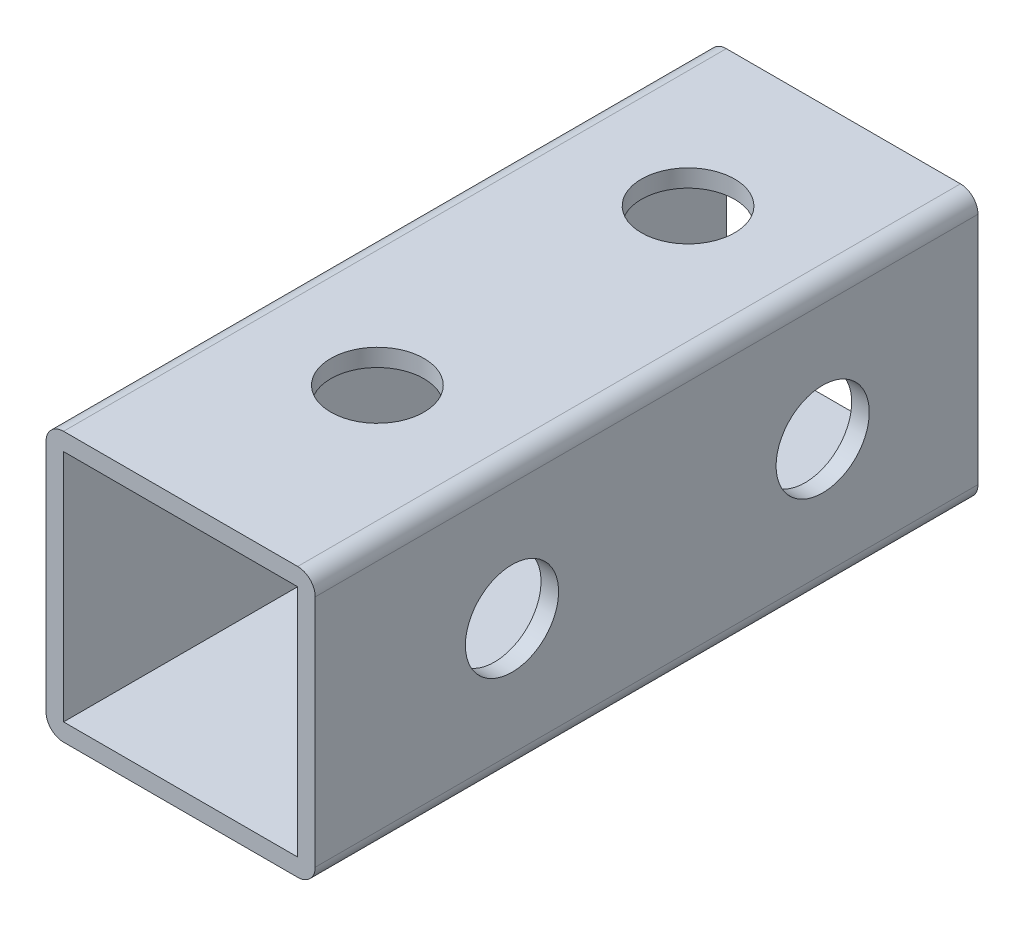
ISO-10303-21;
HEADER;
FILE_DESCRIPTION(('STEP AP214'),'2;1');
FILE_NAME('part.step','',(''),(''),'','','');
FILE_SCHEMA(('AUTOMOTIVE_DESIGN { 1 0 10303 214 1 1 1 1 }'));
ENDSEC;
DATA;
#1=APPLICATION_CONTEXT('core data for automotive mechanical design processes');
#2=APPLICATION_PROTOCOL_DEFINITION('international standard','automotive_design',2000,#1);
#3=PRODUCT_CONTEXT('',#1,'mechanical');
#4=PRODUCT('Part','Part','',(#3));
#5=PRODUCT_RELATED_PRODUCT_CATEGORY('part','',(#4));
#6=PRODUCT_DEFINITION_FORMATION('','',#4);
#7=PRODUCT_DEFINITION_CONTEXT('part definition',#1,'design');
#8=PRODUCT_DEFINITION('design','',#6,#7);
#9=PRODUCT_DEFINITION_SHAPE('','',#8);
#10=(LENGTH_UNIT() NAMED_UNIT(*) SI_UNIT(.MILLI.,.METRE.));
#11=(NAMED_UNIT(*) PLANE_ANGLE_UNIT() SI_UNIT($,.RADIAN.));
#12=(NAMED_UNIT(*) SI_UNIT($,.STERADIAN.) SOLID_ANGLE_UNIT());
#13=UNCERTAINTY_MEASURE_WITH_UNIT(LENGTH_MEASURE(1.E-05),#10,'distance_accuracy_value','');
#14=(GEOMETRIC_REPRESENTATION_CONTEXT(3) GLOBAL_UNCERTAINTY_ASSIGNED_CONTEXT((#13)) GLOBAL_UNIT_ASSIGNED_CONTEXT((#10,
#11,#12)) REPRESENTATION_CONTEXT('',''));
#15=CARTESIAN_POINT('',(0.,0.,0.));
#16=DIRECTION('',(0.,0.,1.));
#17=DIRECTION('',(1.,0.,0.));
#18=AXIS2_PLACEMENT_3D('',#15,#16,#17);
#19=CARTESIAN_POINT('',(17.9451,17.9451,101.6));
#20=DIRECTION('',(0.,0.,-1.));
#21=DIRECTION('',(-1.,0.,0.));
#22=AXIS2_PLACEMENT_3D('',#19,#20,#21);
#23=PLANE('',#22);
#24=CARTESIAN_POINT('',(17.9451,17.9451,101.6));
#25=DIRECTION('',(0.,0.,1.));
#26=DIRECTION('',(-1.,0.,0.));
#27=AXIS2_PLACEMENT_3D('',#24,#25,#26);
#28=CIRCLE('',#27,2.6924);
#29=CARTESIAN_POINT('',(20.6375,17.9451,101.6));
#30=VERTEX_POINT('',#29);
#31=CARTESIAN_POINT('',(17.9451,20.6375,101.6));
#32=VERTEX_POINT('',#31);
#33=EDGE_CURVE('E161',#30,#32,#28,.T.);
#34=ORIENTED_EDGE('',*,*,#33,.T.);
#35=DIRECTION('',(-1.,0.,0.));
#36=VECTOR('',#35,1.);
#37=CARTESIAN_POINT('',(-17.9451,20.6375,101.6));
#38=LINE('',#37,#36);
#39=CARTESIAN_POINT('',(-17.9451,20.6375,101.6));
#40=VERTEX_POINT('',#39);
#41=EDGE_CURVE('E164',#32,#40,#38,.T.);
#42=ORIENTED_EDGE('',*,*,#41,.T.);
#43=CARTESIAN_POINT('',(-17.9451,17.9451,101.6));
#44=DIRECTION('',(0.,0.,1.));
#45=DIRECTION('',(1.,0.,0.));
#46=AXIS2_PLACEMENT_3D('',#43,#44,#45);
#47=CIRCLE('',#46,2.6924);
#48=CARTESIAN_POINT('',(-20.6375,17.9451,101.6));
#49=VERTEX_POINT('',#48);
#50=EDGE_CURVE('E167',#40,#49,#47,.T.);
#51=ORIENTED_EDGE('',*,*,#50,.T.);
#52=DIRECTION('',(0.,-1.,0.));
#53=VECTOR('',#52,1.);
#54=CARTESIAN_POINT('',(-20.6375,17.9451,101.6));
#55=LINE('',#54,#53);
#56=CARTESIAN_POINT('',(-20.6375,-17.9451,101.6));
#57=VERTEX_POINT('',#56);
#58=EDGE_CURVE('E169',#49,#57,#55,.T.);
#59=ORIENTED_EDGE('',*,*,#58,.T.);
#60=CARTESIAN_POINT('',(-17.9451,-17.9451,101.6));
#61=DIRECTION('',(0.,0.,1.));
#62=DIRECTION('',(-1.,0.,0.));
#63=AXIS2_PLACEMENT_3D('',#60,#61,#62);
#64=CIRCLE('',#63,2.6924);
#65=CARTESIAN_POINT('',(-17.9451,-20.6375,101.6));
#66=VERTEX_POINT('',#65);
#67=EDGE_CURVE('E171',#57,#66,#64,.T.);
#68=ORIENTED_EDGE('',*,*,#67,.T.);
#69=DIRECTION('',(1.,0.,0.));
#70=VECTOR('',#69,1.);
#71=CARTESIAN_POINT('',(-17.9451,-20.6375,101.6));
#72=LINE('',#71,#70);
#73=CARTESIAN_POINT('',(17.9451,-20.6375,101.6));
#74=VERTEX_POINT('',#73);
#75=EDGE_CURVE('E173',#66,#74,#72,.T.);
#76=ORIENTED_EDGE('',*,*,#75,.T.);
#77=CARTESIAN_POINT('',(17.9451,-17.9451,101.6));
#78=DIRECTION('',(0.,0.,1.));
#79=DIRECTION('',(1.,0.,0.));
#80=AXIS2_PLACEMENT_3D('',#77,#78,#79);
#81=CIRCLE('',#80,2.6924);
#82=CARTESIAN_POINT('',(20.6375,-17.9451,101.6));
#83=VERTEX_POINT('',#82);
#84=EDGE_CURVE('E175',#74,#83,#81,.T.);
#85=ORIENTED_EDGE('',*,*,#84,.T.);
#86=DIRECTION('',(0.,1.,0.));
#87=VECTOR('',#86,1.);
#88=CARTESIAN_POINT('',(20.6375,-17.9451,101.6));
#89=LINE('',#88,#87);
#90=EDGE_CURVE('E177',#83,#30,#89,.T.);
#91=ORIENTED_EDGE('',*,*,#90,.T.);
#92=EDGE_LOOP('',(#34,#42,#51,#59,#68,#76,#85,#91));
#93=FACE_BOUND('',#92,.T.);
#94=DIRECTION('',(0.,1.,0.));
#95=VECTOR('',#94,1.);
#96=CARTESIAN_POINT('',(17.9451,-17.9451,101.6));
#97=LINE('',#96,#95);
#98=CARTESIAN_POINT('',(17.9451,-17.9451,101.6));
#99=VERTEX_POINT('',#98);
#100=CARTESIAN_POINT('',(17.9451,17.9451,101.6));
#101=VERTEX_POINT('',#100);
#102=EDGE_CURVE('E123',#99,#101,#97,.T.);
#103=ORIENTED_EDGE('',*,*,#102,.F.);
#104=DIRECTION('',(1.,0.,0.));
#105=VECTOR('',#104,1.);
#106=CARTESIAN_POINT('',(-17.9451,-17.9451,101.6));
#107=LINE('',#106,#105);
#108=CARTESIAN_POINT('',(-17.9451,-17.9451,101.6));
#109=VERTEX_POINT('',#108);
#110=EDGE_CURVE('E145',#109,#99,#107,.T.);
#111=ORIENTED_EDGE('',*,*,#110,.F.);
#112=DIRECTION('',(0.,-1.,0.));
#113=VECTOR('',#112,1.);
#114=CARTESIAN_POINT('',(-17.9451,17.9451,101.6));
#115=LINE('',#114,#113);
#116=CARTESIAN_POINT('',(-17.9451,17.9451,101.6));
#117=VERTEX_POINT('',#116);
#118=EDGE_CURVE('E143',#117,#109,#115,.T.);
#119=ORIENTED_EDGE('',*,*,#118,.F.);
#120=DIRECTION('',(-1.,0.,0.));
#121=VECTOR('',#120,1.);
#122=CARTESIAN_POINT('',(-17.9451,17.9451,101.6));
#123=LINE('',#122,#121);
#124=EDGE_CURVE('E131',#101,#117,#123,.T.);
#125=ORIENTED_EDGE('',*,*,#124,.F.);
#126=EDGE_LOOP('',(#103,#111,#119,#125));
#127=FACE_BOUND('',#126,.T.);
#128=ADVANCED_FACE('F32',(#93,#127),#23,.F.);
#129=CARTESIAN_POINT('',(17.9451,17.9451,0.));
#130=DIRECTION('',(0.,0.,-1.));
#131=DIRECTION('',(-1.,0.,0.));
#132=AXIS2_PLACEMENT_3D('',#129,#130,#131);
#133=PLANE('',#132);
#134=CARTESIAN_POINT('',(17.9451,17.9451,0.));
#135=DIRECTION('',(0.,0.,1.));
#136=DIRECTION('',(-1.,0.,0.));
#137=AXIS2_PLACEMENT_3D('',#134,#135,#136);
#138=CIRCLE('',#137,2.6924);
#139=CARTESIAN_POINT('',(20.6375,17.9451,0.));
#140=VERTEX_POINT('',#139);
#141=CARTESIAN_POINT('',(17.9451,20.6375,0.));
#142=VERTEX_POINT('',#141);
#143=EDGE_CURVE('E139',#140,#142,#138,.T.);
#144=ORIENTED_EDGE('',*,*,#143,.F.);
#145=DIRECTION('',(0.,1.,0.));
#146=VECTOR('',#145,1.);
#147=CARTESIAN_POINT('',(20.6375,-17.9451,0.));
#148=LINE('',#147,#146);
#149=CARTESIAN_POINT('',(20.6375,-17.9451,0.));
#150=VERTEX_POINT('',#149);
#151=EDGE_CURVE('E165',#150,#140,#148,.T.);
#152=ORIENTED_EDGE('',*,*,#151,.F.);
#153=CARTESIAN_POINT('',(17.9451,-17.9451,0.));
#154=DIRECTION('',(0.,0.,1.));
#155=DIRECTION('',(1.,0.,0.));
#156=AXIS2_PLACEMENT_3D('',#153,#154,#155);
#157=CIRCLE('',#156,2.6924);
#158=CARTESIAN_POINT('',(17.9451,-20.6375,0.));
#159=VERTEX_POINT('',#158);
#160=EDGE_CURVE('E192',#159,#150,#157,.T.);
#161=ORIENTED_EDGE('',*,*,#160,.F.);
#162=DIRECTION('',(1.,0.,0.));
#163=VECTOR('',#162,1.);
#164=CARTESIAN_POINT('',(-17.9451,-20.6375,0.));
#165=LINE('',#164,#163);
#166=CARTESIAN_POINT('',(-17.9451,-20.6375,0.));
#167=VERTEX_POINT('',#166);
#168=EDGE_CURVE('E190',#167,#159,#165,.T.);
#169=ORIENTED_EDGE('',*,*,#168,.F.);
#170=CARTESIAN_POINT('',(-17.9451,-17.9451,0.));
#171=DIRECTION('',(0.,0.,1.));
#172=DIRECTION('',(-1.,0.,0.));
#173=AXIS2_PLACEMENT_3D('',#170,#171,#172);
#174=CIRCLE('',#173,2.6924);
#175=CARTESIAN_POINT('',(-20.6375,-17.9451,0.));
#176=VERTEX_POINT('',#175);
#177=EDGE_CURVE('E188',#176,#167,#174,.T.);
#178=ORIENTED_EDGE('',*,*,#177,.F.);
#179=DIRECTION('',(0.,-1.,0.));
#180=VECTOR('',#179,1.);
#181=CARTESIAN_POINT('',(-20.6375,17.9451,0.));
#182=LINE('',#181,#180);
#183=CARTESIAN_POINT('',(-20.6375,17.9451,0.));
#184=VERTEX_POINT('',#183);
#185=EDGE_CURVE('E186',#184,#176,#182,.T.);
#186=ORIENTED_EDGE('',*,*,#185,.F.);
#187=CARTESIAN_POINT('',(-17.9451,17.9451,0.));
#188=DIRECTION('',(0.,0.,1.));
#189=DIRECTION('',(1.,0.,0.));
#190=AXIS2_PLACEMENT_3D('',#187,#188,#189);
#191=CIRCLE('',#190,2.6924);
#192=CARTESIAN_POINT('',(-17.9451,20.6375,0.));
#193=VERTEX_POINT('',#192);
#194=EDGE_CURVE('E184',#193,#184,#191,.T.);
#195=ORIENTED_EDGE('',*,*,#194,.F.);
#196=DIRECTION('',(-1.,0.,0.));
#197=VECTOR('',#196,1.);
#198=CARTESIAN_POINT('',(-17.9451,20.6375,0.));
#199=LINE('',#198,#197);
#200=EDGE_CURVE('E182',#142,#193,#199,.T.);
#201=ORIENTED_EDGE('',*,*,#200,.F.);
#202=EDGE_LOOP('',(#144,#152,#161,#169,#178,#186,#195,#201));
#203=FACE_BOUND('',#202,.T.);
#204=DIRECTION('',(1.,0.,0.));
#205=VECTOR('',#204,1.);
#206=CARTESIAN_POINT('',(-17.9451,-17.9451,0.));
#207=LINE('',#206,#205);
#208=CARTESIAN_POINT('',(-17.9451,-17.9451,0.));
#209=VERTEX_POINT('',#208);
#210=CARTESIAN_POINT('',(17.9451,-17.9451,0.));
#211=VERTEX_POINT('',#210);
#212=EDGE_CURVE('E132',#209,#211,#207,.T.);
#213=ORIENTED_EDGE('',*,*,#212,.T.);
#214=DIRECTION('',(0.,1.,0.));
#215=VECTOR('',#214,1.);
#216=CARTESIAN_POINT('',(17.9451,-17.9451,0.));
#217=LINE('',#216,#215);
#218=CARTESIAN_POINT('',(17.9451,17.9451,0.));
#219=VERTEX_POINT('',#218);
#220=EDGE_CURVE('E57',#211,#219,#217,.T.);
#221=ORIENTED_EDGE('',*,*,#220,.T.);
#222=DIRECTION('',(-1.,0.,0.));
#223=VECTOR('',#222,1.);
#224=CARTESIAN_POINT('',(-17.9451,17.9451,0.));
#225=LINE('',#224,#223);
#226=CARTESIAN_POINT('',(-17.9451,17.9451,0.));
#227=VERTEX_POINT('',#226);
#228=EDGE_CURVE('E138',#219,#227,#225,.T.);
#229=ORIENTED_EDGE('',*,*,#228,.T.);
#230=DIRECTION('',(0.,-1.,0.));
#231=VECTOR('',#230,1.);
#232=CARTESIAN_POINT('',(-17.9451,17.9451,0.));
#233=LINE('',#232,#231);
#234=EDGE_CURVE('E153',#227,#209,#233,.T.);
#235=ORIENTED_EDGE('',*,*,#234,.T.);
#236=EDGE_LOOP('',(#213,#221,#229,#235));
#237=FACE_BOUND('',#236,.T.);
#238=ADVANCED_FACE('F281',(#203,#237),#133,.T.);
#239=CARTESIAN_POINT('',(17.9451,17.9451,101.6));
#240=DIRECTION('',(0.,0.,-1.));
#241=DIRECTION('',(-1.,0.,0.));
#242=AXIS2_PLACEMENT_3D('',#239,#240,#241);
#243=CYLINDRICAL_SURFACE('',#242,2.6924);
#244=ORIENTED_EDGE('',*,*,#143,.T.);
#245=DIRECTION('',(0.,0.,-1.));
#246=VECTOR('',#245,1.);
#247=CARTESIAN_POINT('',(17.9451,20.6375,101.6));
#248=LINE('',#247,#246);
#249=EDGE_CURVE('E11',#32,#142,#248,.T.);
#250=ORIENTED_EDGE('',*,*,#249,.F.);
#251=ORIENTED_EDGE('',*,*,#33,.F.);
#252=DIRECTION('',(0.,0.,-1.));
#253=VECTOR('',#252,1.);
#254=CARTESIAN_POINT('',(20.6375,17.9451,101.6));
#255=LINE('',#254,#253);
#256=EDGE_CURVE('E179',#30,#140,#255,.T.);
#257=ORIENTED_EDGE('',*,*,#256,.T.);
#258=EDGE_LOOP('',(#244,#250,#251,#257));
#259=FACE_BOUND('',#258,.T.);
#260=ADVANCED_FACE('F34',(#259),#243,.T.);
#261=CARTESIAN_POINT('',(-17.9451,20.6375,101.6));
#262=DIRECTION('',(0.,-1.,0.));
#263=DIRECTION('',(0.,0.,-1.));
#264=AXIS2_PLACEMENT_3D('',#261,#262,#263);
#265=PLANE('',#264);
#266=CARTESIAN_POINT('',(0.,20.6375,71.4375));
#267=DIRECTION('',(0.,1.,0.));
#268=DIRECTION('',(0.,0.,1.));
#269=AXIS2_PLACEMENT_3D('',#266,#267,#268);
#270=CIRCLE('',#269,7.14375);
#271=CARTESIAN_POINT('',(0.,20.6375,78.58125));
#272=VERTEX_POINT('',#271);
#273=EDGE_CURVE('E233',#272,#272,#270,.T.);
#274=ORIENTED_EDGE('',*,*,#273,.F.);
#275=EDGE_LOOP('',(#274));
#276=FACE_BOUND('',#275,.T.);
#277=CARTESIAN_POINT('',(0.,20.6375,23.8125));
#278=DIRECTION('',(0.,1.,0.));
#279=DIRECTION('',(0.,0.,1.));
#280=AXIS2_PLACEMENT_3D('',#277,#278,#279);
#281=CIRCLE('',#280,7.14375);
#282=CARTESIAN_POINT('',(0.,20.6375,30.95625));
#283=VERTEX_POINT('',#282);
#284=EDGE_CURVE('E255',#283,#283,#281,.T.);
#285=ORIENTED_EDGE('',*,*,#284,.F.);
#286=EDGE_LOOP('',(#285));
#287=FACE_BOUND('',#286,.T.);
#288=ORIENTED_EDGE('',*,*,#200,.T.);
#289=DIRECTION('',(0.,0.,-1.));
#290=VECTOR('',#289,1.);
#291=CARTESIAN_POINT('',(-17.9451,20.6375,101.6));
#292=LINE('',#291,#290);
#293=EDGE_CURVE('E41',#40,#193,#292,.T.);
#294=ORIENTED_EDGE('',*,*,#293,.F.);
#295=ORIENTED_EDGE('',*,*,#41,.F.);
#296=ORIENTED_EDGE('',*,*,#249,.T.);
#297=EDGE_LOOP('',(#288,#294,#295,#296));
#298=FACE_BOUND('',#297,.T.);
#299=ADVANCED_FACE('F310',(#276,#287,#298),#265,.F.);
#300=CARTESIAN_POINT('',(-17.9451,17.9451,101.6));
#301=DIRECTION('',(0.,0.,-1.));
#302=DIRECTION('',(-1.,0.,0.));
#303=AXIS2_PLACEMENT_3D('',#300,#301,#302);
#304=CYLINDRICAL_SURFACE('',#303,2.6924);
#305=ORIENTED_EDGE('',*,*,#194,.T.);
#306=DIRECTION('',(0.,0.,-1.));
#307=VECTOR('',#306,1.);
#308=CARTESIAN_POINT('',(-20.6375,17.9451,101.6));
#309=LINE('',#308,#307);
#310=EDGE_CURVE('E209',#49,#184,#309,.T.);
#311=ORIENTED_EDGE('',*,*,#310,.F.);
#312=ORIENTED_EDGE('',*,*,#50,.F.);
#313=ORIENTED_EDGE('',*,*,#293,.T.);
#314=EDGE_LOOP('',(#305,#311,#312,#313));
#315=FACE_BOUND('',#314,.T.);
#316=ADVANCED_FACE('F307',(#315),#304,.T.);
#317=CARTESIAN_POINT('',(-20.6375,17.9451,101.6));
#318=DIRECTION('',(1.,0.,0.));
#319=DIRECTION('',(0.,0.,-1.));
#320=AXIS2_PLACEMENT_3D('',#317,#318,#319);
#321=PLANE('',#320);
#322=CARTESIAN_POINT('',(-20.6375,0.,71.4375));
#323=DIRECTION('',(-1.,0.,0.));
#324=DIRECTION('',(0.,0.,1.));
#325=AXIS2_PLACEMENT_3D('',#322,#323,#324);
#326=CIRCLE('',#325,7.14375);
#327=CARTESIAN_POINT('',(-20.6375,0.,78.58125));
#328=VERTEX_POINT('',#327);
#329=EDGE_CURVE('E235',#328,#328,#326,.T.);
#330=ORIENTED_EDGE('',*,*,#329,.F.);
#331=EDGE_LOOP('',(#330));
#332=FACE_BOUND('',#331,.T.);
#333=CARTESIAN_POINT('',(-20.6375,0.,23.8125));
#334=DIRECTION('',(-1.,0.,0.));
#335=DIRECTION('',(0.,0.,1.));
#336=AXIS2_PLACEMENT_3D('',#333,#334,#335);
#337=CIRCLE('',#336,7.14375);
#338=CARTESIAN_POINT('',(-20.6375,0.,30.95625));
#339=VERTEX_POINT('',#338);
#340=EDGE_CURVE('E248',#339,#339,#337,.T.);
#341=ORIENTED_EDGE('',*,*,#340,.F.);
#342=EDGE_LOOP('',(#341));
#343=FACE_BOUND('',#342,.T.);
#344=ORIENTED_EDGE('',*,*,#185,.T.);
#345=DIRECTION('',(0.,0.,-1.));
#346=VECTOR('',#345,1.);
#347=CARTESIAN_POINT('',(-20.6375,-17.9451,101.6));
#348=LINE('',#347,#346);
#349=EDGE_CURVE('E206',#57,#176,#348,.T.);
#350=ORIENTED_EDGE('',*,*,#349,.F.);
#351=ORIENTED_EDGE('',*,*,#58,.F.);
#352=ORIENTED_EDGE('',*,*,#310,.T.);
#353=EDGE_LOOP('',(#344,#350,#351,#352));
#354=FACE_BOUND('',#353,.T.);
#355=ADVANCED_FACE('F303',(#332,#343,#354),#321,.F.);
#356=CARTESIAN_POINT('',(-17.9451,-17.9451,101.6));
#357=DIRECTION('',(0.,0.,-1.));
#358=DIRECTION('',(-1.,0.,0.));
#359=AXIS2_PLACEMENT_3D('',#356,#357,#358);
#360=CYLINDRICAL_SURFACE('',#359,2.6924);
#361=ORIENTED_EDGE('',*,*,#177,.T.);
#362=DIRECTION('',(0.,0.,-1.));
#363=VECTOR('',#362,1.);
#364=CARTESIAN_POINT('',(-17.9451,-20.6375,101.6));
#365=LINE('',#364,#363);
#366=EDGE_CURVE('E203',#66,#167,#365,.T.);
#367=ORIENTED_EDGE('',*,*,#366,.F.);
#368=ORIENTED_EDGE('',*,*,#67,.F.);
#369=ORIENTED_EDGE('',*,*,#349,.T.);
#370=EDGE_LOOP('',(#361,#367,#368,#369));
#371=FACE_BOUND('',#370,.T.);
#372=ADVANCED_FACE('F299',(#371),#360,.T.);
#373=CARTESIAN_POINT('',(-17.9451,-20.6375,101.6));
#374=DIRECTION('',(0.,1.,0.));
#375=DIRECTION('',(0.,0.,1.));
#376=AXIS2_PLACEMENT_3D('',#373,#374,#375);
#377=PLANE('',#376);
#378=CARTESIAN_POINT('',(0.,-20.6375,71.4375));
#379=DIRECTION('',(0.,1.,0.));
#380=DIRECTION('',(0.,0.,1.));
#381=AXIS2_PLACEMENT_3D('',#378,#379,#380);
#382=CIRCLE('',#381,7.14375);
#383=CARTESIAN_POINT('',(0.,-20.6375,78.58125));
#384=VERTEX_POINT('',#383);
#385=EDGE_CURVE('E226',#384,#384,#382,.T.);
#386=ORIENTED_EDGE('',*,*,#385,.T.);
#387=EDGE_LOOP('',(#386));
#388=FACE_BOUND('',#387,.T.);
#389=CARTESIAN_POINT('',(0.,-20.6375,23.8125));
#390=DIRECTION('',(0.,1.,0.));
#391=DIRECTION('',(0.,0.,1.));
#392=AXIS2_PLACEMENT_3D('',#389,#390,#391);
#393=CIRCLE('',#392,7.14375);
#394=CARTESIAN_POINT('',(0.,-20.6375,30.95625));
#395=VERTEX_POINT('',#394);
#396=EDGE_CURVE('E217',#395,#395,#393,.T.);
#397=ORIENTED_EDGE('',*,*,#396,.T.);
#398=EDGE_LOOP('',(#397));
#399=FACE_BOUND('',#398,.T.);
#400=ORIENTED_EDGE('',*,*,#168,.T.);
#401=DIRECTION('',(0.,0.,-1.));
#402=VECTOR('',#401,1.);
#403=CARTESIAN_POINT('',(17.9451,-20.6375,101.6));
#404=LINE('',#403,#402);
#405=EDGE_CURVE('E200',#74,#159,#404,.T.);
#406=ORIENTED_EDGE('',*,*,#405,.F.);
#407=ORIENTED_EDGE('',*,*,#75,.F.);
#408=ORIENTED_EDGE('',*,*,#366,.T.);
#409=EDGE_LOOP('',(#400,#406,#407,#408));
#410=FACE_BOUND('',#409,.T.);
#411=ADVANCED_FACE('F295',(#388,#399,#410),#377,.F.);
#412=CARTESIAN_POINT('',(17.9451,-17.9451,101.6));
#413=DIRECTION('',(0.,0.,-1.));
#414=DIRECTION('',(-1.,0.,0.));
#415=AXIS2_PLACEMENT_3D('',#412,#413,#414);
#416=CYLINDRICAL_SURFACE('',#415,2.6924);
#417=ORIENTED_EDGE('',*,*,#160,.T.);
#418=DIRECTION('',(0.,0.,-1.));
#419=VECTOR('',#418,1.);
#420=CARTESIAN_POINT('',(20.6375,-17.9451,101.6));
#421=LINE('',#420,#419);
#422=EDGE_CURVE('E197',#83,#150,#421,.T.);
#423=ORIENTED_EDGE('',*,*,#422,.F.);
#424=ORIENTED_EDGE('',*,*,#84,.F.);
#425=ORIENTED_EDGE('',*,*,#405,.T.);
#426=EDGE_LOOP('',(#417,#423,#424,#425));
#427=FACE_BOUND('',#426,.T.);
#428=ADVANCED_FACE('F292',(#427),#416,.T.);
#429=CARTESIAN_POINT('',(20.6375,-17.9451,101.6));
#430=DIRECTION('',(-1.,0.,0.));
#431=DIRECTION('',(0.,0.,1.));
#432=AXIS2_PLACEMENT_3D('',#429,#430,#431);
#433=PLANE('',#432);
#434=CARTESIAN_POINT('',(20.6375000000001,0.,71.4375));
#435=DIRECTION('',(-1.,0.,0.));
#436=DIRECTION('',(0.,0.,1.));
#437=AXIS2_PLACEMENT_3D('',#434,#435,#436);
#438=CIRCLE('',#437,7.14375);
#439=CARTESIAN_POINT('',(20.6375000000001,0.,78.58125));
#440=VERTEX_POINT('',#439);
#441=EDGE_CURVE('E229',#440,#440,#438,.T.);
#442=ORIENTED_EDGE('',*,*,#441,.T.);
#443=EDGE_LOOP('',(#442));
#444=FACE_BOUND('',#443,.T.);
#445=CARTESIAN_POINT('',(20.6375000000001,0.,23.8125));
#446=DIRECTION('',(-1.,0.,0.));
#447=DIRECTION('',(0.,0.,1.));
#448=AXIS2_PLACEMENT_3D('',#445,#446,#447);
#449=CIRCLE('',#448,7.14375);
#450=CARTESIAN_POINT('',(20.6375000000001,0.,30.95625));
#451=VERTEX_POINT('',#450);
#452=EDGE_CURVE('E222',#451,#451,#449,.T.);
#453=ORIENTED_EDGE('',*,*,#452,.T.);
#454=EDGE_LOOP('',(#453));
#455=FACE_BOUND('',#454,.T.);
#456=ORIENTED_EDGE('',*,*,#151,.T.);
#457=ORIENTED_EDGE('',*,*,#256,.F.);
#458=ORIENTED_EDGE('',*,*,#90,.F.);
#459=ORIENTED_EDGE('',*,*,#422,.T.);
#460=EDGE_LOOP('',(#456,#457,#458,#459));
#461=FACE_BOUND('',#460,.T.);
#462=ADVANCED_FACE('F276',(#444,#455,#461),#433,.F.);
#463=CARTESIAN_POINT('',(17.9451,-17.9451,101.6));
#464=DIRECTION('',(-1.,0.,0.));
#465=DIRECTION('',(0.,0.,1.));
#466=AXIS2_PLACEMENT_3D('',#463,#464,#465);
#467=PLANE('',#466);
#468=CARTESIAN_POINT('',(17.9451,0.,71.4375));
#469=DIRECTION('',(-1.,0.,0.));
#470=DIRECTION('',(0.,0.,1.));
#471=AXIS2_PLACEMENT_3D('',#468,#469,#470);
#472=CIRCLE('',#471,7.14375);
#473=CARTESIAN_POINT('',(17.9451,0.,78.58125));
#474=VERTEX_POINT('',#473);
#475=EDGE_CURVE('E36',#474,#474,#472,.T.);
#476=ORIENTED_EDGE('',*,*,#475,.F.);
#477=EDGE_LOOP('',(#476));
#478=FACE_BOUND('',#477,.T.);
#479=CARTESIAN_POINT('',(17.9451,0.,23.8125));
#480=DIRECTION('',(-1.,0.,0.));
#481=DIRECTION('',(0.,0.,1.));
#482=AXIS2_PLACEMENT_3D('',#479,#480,#481);
#483=CIRCLE('',#482,7.14375);
#484=CARTESIAN_POINT('',(17.9451,0.,30.95625));
#485=VERTEX_POINT('',#484);
#486=EDGE_CURVE('E221',#485,#485,#483,.T.);
#487=ORIENTED_EDGE('',*,*,#486,.F.);
#488=EDGE_LOOP('',(#487));
#489=FACE_BOUND('',#488,.T.);
#490=ORIENTED_EDGE('',*,*,#220,.F.);
#491=DIRECTION('',(0.,0.,-1.));
#492=VECTOR('',#491,1.);
#493=CARTESIAN_POINT('',(17.9451,-17.9451,101.6));
#494=LINE('',#493,#492);
#495=EDGE_CURVE('E127',#99,#211,#494,.T.);
#496=ORIENTED_EDGE('',*,*,#495,.F.);
#497=ORIENTED_EDGE('',*,*,#102,.T.);
#498=DIRECTION('',(0.,0.,-1.));
#499=VECTOR('',#498,1.);
#500=CARTESIAN_POINT('',(17.9451,17.9451,101.6));
#501=LINE('',#500,#499);
#502=EDGE_CURVE('E126',#101,#219,#501,.T.);
#503=ORIENTED_EDGE('',*,*,#502,.T.);
#504=EDGE_LOOP('',(#490,#496,#497,#503));
#505=FACE_BOUND('',#504,.T.);
#506=ADVANCED_FACE('F125',(#478,#489,#505),#467,.T.);
#507=CARTESIAN_POINT('',(-17.9451,17.9451,101.6));
#508=DIRECTION('',(0.,-1.,0.));
#509=DIRECTION('',(0.,0.,-1.));
#510=AXIS2_PLACEMENT_3D('',#507,#508,#509);
#511=PLANE('',#510);
#512=CARTESIAN_POINT('',(0.,17.9451,71.4375));
#513=DIRECTION('',(0.,-1.,0.));
#514=DIRECTION('',(0.,0.,-1.));
#515=AXIS2_PLACEMENT_3D('',#512,#513,#514);
#516=CIRCLE('',#515,7.14375);
#517=CARTESIAN_POINT('',(0.,17.9451,64.29375));
#518=VERTEX_POINT('',#517);
#519=EDGE_CURVE('E225',#518,#518,#516,.T.);
#520=ORIENTED_EDGE('',*,*,#519,.F.);
#521=EDGE_LOOP('',(#520));
#522=FACE_BOUND('',#521,.T.);
#523=CARTESIAN_POINT('',(0.,17.9451,23.8125));
#524=DIRECTION('',(0.,-1.,0.));
#525=DIRECTION('',(0.,0.,-1.));
#526=AXIS2_PLACEMENT_3D('',#523,#524,#525);
#527=CIRCLE('',#526,7.14375);
#528=CARTESIAN_POINT('',(0.,17.9451,16.66875));
#529=VERTEX_POINT('',#528);
#530=EDGE_CURVE('E151',#529,#529,#527,.T.);
#531=ORIENTED_EDGE('',*,*,#530,.F.);
#532=EDGE_LOOP('',(#531));
#533=FACE_BOUND('',#532,.T.);
#534=ORIENTED_EDGE('',*,*,#228,.F.);
#535=ORIENTED_EDGE('',*,*,#502,.F.);
#536=ORIENTED_EDGE('',*,*,#124,.T.);
#537=DIRECTION('',(0.,0.,-1.));
#538=VECTOR('',#537,1.);
#539=CARTESIAN_POINT('',(-17.9451,17.9451,101.6));
#540=LINE('',#539,#538);
#541=EDGE_CURVE('E140',#117,#227,#540,.T.);
#542=ORIENTED_EDGE('',*,*,#541,.T.);
#543=EDGE_LOOP('',(#534,#535,#536,#542));
#544=FACE_BOUND('',#543,.T.);
#545=ADVANCED_FACE('F135',(#522,#533,#544),#511,.T.);
#546=CARTESIAN_POINT('',(-17.9451,17.9451,101.6));
#547=DIRECTION('',(1.,0.,0.));
#548=DIRECTION('',(0.,0.,-1.));
#549=AXIS2_PLACEMENT_3D('',#546,#547,#548);
#550=PLANE('',#549);
#551=CARTESIAN_POINT('',(-17.9451,0.,71.4375));
#552=DIRECTION('',(1.,0.,0.));
#553=DIRECTION('',(0.,0.,-1.));
#554=AXIS2_PLACEMENT_3D('',#551,#552,#553);
#555=CIRCLE('',#554,7.14375);
#556=CARTESIAN_POINT('',(-17.9451,0.,64.29375));
#557=VERTEX_POINT('',#556);
#558=EDGE_CURVE('E227',#557,#557,#555,.T.);
#559=ORIENTED_EDGE('',*,*,#558,.F.);
#560=EDGE_LOOP('',(#559));
#561=FACE_BOUND('',#560,.T.);
#562=CARTESIAN_POINT('',(-17.9451,0.,23.8125));
#563=DIRECTION('',(1.,0.,0.));
#564=DIRECTION('',(0.,0.,-1.));
#565=AXIS2_PLACEMENT_3D('',#562,#563,#564);
#566=CIRCLE('',#565,7.14375);
#567=CARTESIAN_POINT('',(-17.9451,0.,16.66875));
#568=VERTEX_POINT('',#567);
#569=EDGE_CURVE('E218',#568,#568,#566,.T.);
#570=ORIENTED_EDGE('',*,*,#569,.F.);
#571=EDGE_LOOP('',(#570));
#572=FACE_BOUND('',#571,.T.);
#573=ORIENTED_EDGE('',*,*,#234,.F.);
#574=ORIENTED_EDGE('',*,*,#541,.F.);
#575=ORIENTED_EDGE('',*,*,#118,.T.);
#576=DIRECTION('',(0.,0.,-1.));
#577=VECTOR('',#576,1.);
#578=CARTESIAN_POINT('',(-17.9451,-17.9451,101.6));
#579=LINE('',#578,#577);
#580=EDGE_CURVE('E49',#109,#209,#579,.T.);
#581=ORIENTED_EDGE('',*,*,#580,.T.);
#582=EDGE_LOOP('',(#573,#574,#575,#581));
#583=FACE_BOUND('',#582,.T.);
#584=ADVANCED_FACE('F266',(#561,#572,#583),#550,.T.);
#585=CARTESIAN_POINT('',(-17.9451,-17.9451,101.6));
#586=DIRECTION('',(0.,1.,0.));
#587=DIRECTION('',(0.,0.,1.));
#588=AXIS2_PLACEMENT_3D('',#585,#586,#587);
#589=PLANE('',#588);
#590=CARTESIAN_POINT('',(0.,-17.9451,71.4375));
#591=DIRECTION('',(0.,1.,0.));
#592=DIRECTION('',(0.,0.,1.));
#593=AXIS2_PLACEMENT_3D('',#590,#591,#592);
#594=CIRCLE('',#593,7.14375);
#595=CARTESIAN_POINT('',(0.,-17.9451,78.58125));
#596=VERTEX_POINT('',#595);
#597=EDGE_CURVE('E223',#596,#596,#594,.T.);
#598=ORIENTED_EDGE('',*,*,#597,.F.);
#599=EDGE_LOOP('',(#598));
#600=FACE_BOUND('',#599,.T.);
#601=CARTESIAN_POINT('',(0.,-17.9451,23.8125));
#602=DIRECTION('',(0.,1.,0.));
#603=DIRECTION('',(0.,0.,1.));
#604=AXIS2_PLACEMENT_3D('',#601,#602,#603);
#605=CIRCLE('',#604,7.14375);
#606=CARTESIAN_POINT('',(0.,-17.9451,30.95625));
#607=VERTEX_POINT('',#606);
#608=EDGE_CURVE('E214',#607,#607,#605,.T.);
#609=ORIENTED_EDGE('',*,*,#608,.F.);
#610=EDGE_LOOP('',(#609));
#611=FACE_BOUND('',#610,.T.);
#612=ORIENTED_EDGE('',*,*,#212,.F.);
#613=ORIENTED_EDGE('',*,*,#580,.F.);
#614=ORIENTED_EDGE('',*,*,#110,.T.);
#615=ORIENTED_EDGE('',*,*,#495,.T.);
#616=EDGE_LOOP('',(#612,#613,#614,#615));
#617=FACE_BOUND('',#616,.T.);
#618=ADVANCED_FACE('F273',(#600,#611,#617),#589,.T.);
#619=CARTESIAN_POINT('',(0.,-20.6375,23.8125));
#620=DIRECTION('',(0.,1.,0.));
#621=DIRECTION('',(0.,0.,1.));
#622=AXIS2_PLACEMENT_3D('',#619,#620,#621);
#623=CYLINDRICAL_SURFACE('',#622,7.14375);
#624=ORIENTED_EDGE('',*,*,#608,.T.);
#625=EDGE_LOOP('',(#624));
#626=FACE_BOUND('',#625,.T.);
#627=ORIENTED_EDGE('',*,*,#396,.F.);
#628=EDGE_LOOP('',(#627));
#629=FACE_BOUND('',#628,.T.);
#630=ADVANCED_FACE('F350',(#626,#629),#623,.F.);
#631=ORIENTED_EDGE('',*,*,#530,.T.);
#632=EDGE_LOOP('',(#631));
#633=FACE_BOUND('',#632,.T.);
#634=ORIENTED_EDGE('',*,*,#284,.T.);
#635=EDGE_LOOP('',(#634));
#636=FACE_BOUND('',#635,.T.);
#637=ADVANCED_FACE('F262',(#633,#636),#623,.F.);
#638=CARTESIAN_POINT('',(20.6375000000001,0.,23.8125));
#639=DIRECTION('',(-1.,0.,0.));
#640=DIRECTION('',(0.,-1.,0.));
#641=AXIS2_PLACEMENT_3D('',#638,#639,#640);
#642=CYLINDRICAL_SURFACE('',#641,7.14375);
#643=ORIENTED_EDGE('',*,*,#569,.T.);
#644=EDGE_LOOP('',(#643));
#645=FACE_BOUND('',#644,.T.);
#646=ORIENTED_EDGE('',*,*,#340,.T.);
#647=EDGE_LOOP('',(#646));
#648=FACE_BOUND('',#647,.T.);
#649=ADVANCED_FACE('F361',(#645,#648),#642,.F.);
#650=ORIENTED_EDGE('',*,*,#486,.T.);
#651=EDGE_LOOP('',(#650));
#652=FACE_BOUND('',#651,.T.);
#653=ORIENTED_EDGE('',*,*,#452,.F.);
#654=EDGE_LOOP('',(#653));
#655=FACE_BOUND('',#654,.T.);
#656=ADVANCED_FACE('F364',(#652,#655),#642,.F.);
#657=CARTESIAN_POINT('',(0.,-20.6375,71.4375));
#658=DIRECTION('',(0.,1.,0.));
#659=DIRECTION('',(0.,0.,1.));
#660=AXIS2_PLACEMENT_3D('',#657,#658,#659);
#661=CYLINDRICAL_SURFACE('',#660,7.14375);
#662=ORIENTED_EDGE('',*,*,#597,.T.);
#663=EDGE_LOOP('',(#662));
#664=FACE_BOUND('',#663,.T.);
#665=ORIENTED_EDGE('',*,*,#385,.F.);
#666=EDGE_LOOP('',(#665));
#667=FACE_BOUND('',#666,.T.);
#668=ADVANCED_FACE('F366',(#664,#667),#661,.F.);
#669=ORIENTED_EDGE('',*,*,#519,.T.);
#670=EDGE_LOOP('',(#669));
#671=FACE_BOUND('',#670,.T.);
#672=ORIENTED_EDGE('',*,*,#273,.T.);
#673=EDGE_LOOP('',(#672));
#674=FACE_BOUND('',#673,.T.);
#675=ADVANCED_FACE('F369',(#671,#674),#661,.F.);
#676=CARTESIAN_POINT('',(20.6375000000001,0.,71.4375));
#677=DIRECTION('',(-1.,0.,0.));
#678=DIRECTION('',(0.,-1.,0.));
#679=AXIS2_PLACEMENT_3D('',#676,#677,#678);
#680=CYLINDRICAL_SURFACE('',#679,7.14375);
#681=ORIENTED_EDGE('',*,*,#558,.T.);
#682=EDGE_LOOP('',(#681));
#683=FACE_BOUND('',#682,.T.);
#684=ORIENTED_EDGE('',*,*,#329,.T.);
#685=EDGE_LOOP('',(#684));
#686=FACE_BOUND('',#685,.T.);
#687=ADVANCED_FACE('F373',(#683,#686),#680,.F.);
#688=ORIENTED_EDGE('',*,*,#475,.T.);
#689=EDGE_LOOP('',(#688));
#690=FACE_BOUND('',#689,.T.);
#691=ORIENTED_EDGE('',*,*,#441,.F.);
#692=EDGE_LOOP('',(#691));
#693=FACE_BOUND('',#692,.T.);
#694=ADVANCED_FACE('F371',(#690,#693),#680,.F.);
#695=CLOSED_SHELL('',(#128,#238,#260,#299,#316,#355,#372,#411,#428,#462,#506,#545,#584,#618,
#630,#637,#649,#656,#668,#675,#687,#694));
#696=MANIFOLD_SOLID_BREP('B2',#695);
#697=ADVANCED_BREP_SHAPE_REPRESENTATION('',(#18,#696),#14);
#698=SHAPE_DEFINITION_REPRESENTATION(#9,#697);
ENDSEC;
END-ISO-10303-21;
